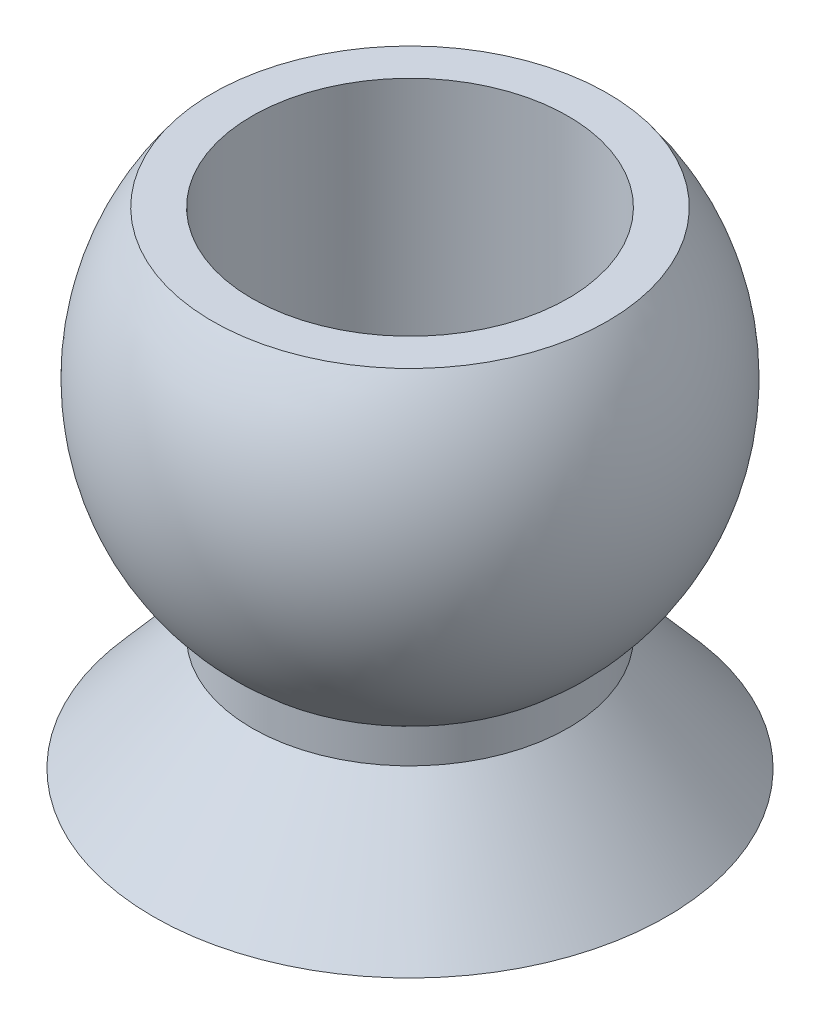
ISO-10303-21;
HEADER;
FILE_DESCRIPTION(('STEP AP214'),'2;1');
FILE_NAME('part.step','',(''),(''),'','','');
FILE_SCHEMA(('AUTOMOTIVE_DESIGN { 1 0 10303 214 1 1 1 1 }'));
ENDSEC;
DATA;
#1=APPLICATION_CONTEXT('core data for automotive mechanical design processes');
#2=APPLICATION_PROTOCOL_DEFINITION('international standard','automotive_design',2000,#1);
#3=PRODUCT_CONTEXT('',#1,'mechanical');
#4=PRODUCT('Part','Part','',(#3));
#5=PRODUCT_RELATED_PRODUCT_CATEGORY('part','',(#4));
#6=PRODUCT_DEFINITION_FORMATION('','',#4);
#7=PRODUCT_DEFINITION_CONTEXT('part definition',#1,'design');
#8=PRODUCT_DEFINITION('design','',#6,#7);
#9=PRODUCT_DEFINITION_SHAPE('','',#8);
#10=(LENGTH_UNIT() NAMED_UNIT(*) SI_UNIT(.MILLI.,.METRE.));
#11=(NAMED_UNIT(*) PLANE_ANGLE_UNIT() SI_UNIT($,.RADIAN.));
#12=(NAMED_UNIT(*) SI_UNIT($,.STERADIAN.) SOLID_ANGLE_UNIT());
#13=UNCERTAINTY_MEASURE_WITH_UNIT(LENGTH_MEASURE(1.E-05),#10,'distance_accuracy_value','');
#14=(GEOMETRIC_REPRESENTATION_CONTEXT(3) GLOBAL_UNCERTAINTY_ASSIGNED_CONTEXT((#13)) GLOBAL_UNIT_ASSIGNED_CONTEXT((#10,
#11,#12)) REPRESENTATION_CONTEXT('',''));
#15=CARTESIAN_POINT('',(0.,0.,0.));
#16=DIRECTION('',(0.,0.,1.));
#17=DIRECTION('',(1.,0.,0.));
#18=AXIS2_PLACEMENT_3D('',#15,#16,#17);
#19=CARTESIAN_POINT('',(0.,-0.960468635614927,0.));
#20=DIRECTION('',(0.,-1.,0.));
#21=DIRECTION('',(0.,0.,-1.));
#22=AXIS2_PLACEMENT_3D('',#19,#20,#21);
#23=PLANE('',#22);
#24=CARTESIAN_POINT('',(0.,-0.960468635614928,0.));
#25=DIRECTION('',(0.,1.,0.));
#26=DIRECTION('',(0.,0.,1.));
#27=AXIS2_PLACEMENT_3D('',#24,#25,#26);
#28=CIRCLE('',#27,0.8);
#29=CARTESIAN_POINT('',(0.,-0.960468635614928,0.8));
#30=VERTEX_POINT('',#29);
#31=EDGE_CURVE('E50',#30,#30,#28,.T.);
#32=ORIENTED_EDGE('',*,*,#31,.T.);
#33=EDGE_LOOP('',(#32));
#34=FACE_BOUND('',#33,.T.);
#35=ADVANCED_FACE('F40',(#34),#23,.F.);
#36=CARTESIAN_POINT('',(0.,-1.71046863561493,0.));
#37=DIRECTION('',(0.,1.,0.));
#38=DIRECTION('',(0.,0.,1.));
#39=AXIS2_PLACEMENT_3D('',#36,#37,#38);
#40=PLANE('',#39);
#41=CARTESIAN_POINT('',(0.,-1.71046863561493,0.));
#42=DIRECTION('',(0.,1.,0.));
#43=DIRECTION('',(0.,0.,1.));
#44=AXIS2_PLACEMENT_3D('',#41,#42,#43);
#45=CIRCLE('',#44,1.3);
#46=CARTESIAN_POINT('',(0.,-1.71046863561493,1.3));
#47=VERTEX_POINT('',#46);
#48=EDGE_CURVE('E11',#47,#47,#45,.T.);
#49=ORIENTED_EDGE('',*,*,#48,.F.);
#50=EDGE_LOOP('',(#49));
#51=FACE_BOUND('',#50,.T.);
#52=ADVANCED_FACE('F65',(#51),#40,.F.);
#53=CARTESIAN_POINT('',(0.,-1.71046863561493,0.));
#54=DIRECTION('',(0.,-1.,0.));
#55=DIRECTION('',(0.,0.,-1.));
#56=AXIS2_PLACEMENT_3D('',#53,#54,#55);
#57=CONICAL_SURFACE('',#56,1.3,0.714485779248294);
#58=CARTESIAN_POINT('',(0.,-1.1340058866526,0.));
#59=DIRECTION('',(0.,1.,0.));
#60=DIRECTION('',(0.,0.,1.));
#61=AXIS2_PLACEMENT_3D('',#58,#59,#60);
#62=CIRCLE('',#61,0.8);
#63=CARTESIAN_POINT('',(0.,-1.1340058866526,0.8));
#64=VERTEX_POINT('',#63);
#65=EDGE_CURVE('E46',#64,#64,#62,.T.);
#66=ORIENTED_EDGE('',*,*,#65,.F.);
#67=EDGE_LOOP('',(#66));
#68=FACE_BOUND('',#67,.T.);
#69=ORIENTED_EDGE('',*,*,#48,.T.);
#70=EDGE_LOOP('',(#69));
#71=FACE_BOUND('',#70,.T.);
#72=ADVANCED_FACE('F60',(#68,#71),#57,.T.);
#73=CARTESIAN_POINT('',(0.,-0.960468635614927,0.));
#74=DIRECTION('',(0.,1.,0.));
#75=DIRECTION('',(0.,0.,1.));
#76=AXIS2_PLACEMENT_3D('',#73,#74,#75);
#77=CYLINDRICAL_SURFACE('',#76,0.8);
#78=ORIENTED_EDGE('',*,*,#31,.F.);
#79=EDGE_LOOP('',(#78));
#80=FACE_BOUND('',#79,.T.);
#81=ORIENTED_EDGE('',*,*,#65,.T.);
#82=EDGE_LOOP('',(#81));
#83=FACE_BOUND('',#82,.T.);
#84=ADVANCED_FACE('F58',(#80,#83),#77,.T.);
#85=CLOSED_SHELL('',(#35,#52,#72,#84));
#86=MANIFOLD_SOLID_BREP('B2',#85);
#87=CARTESIAN_POINT('',(0.,0.,0.));
#88=DIRECTION('',(0.,1.,0.));
#89=DIRECTION('',(1.,0.,0.));
#90=AXIS2_PLACEMENT_3D('',#87,#88,#89);
#91=SPHERICAL_SURFACE('',#90,1.25);
#92=CARTESIAN_POINT('',(0.,-0.960468635614927,0.));
#93=DIRECTION('',(0.,1.,0.));
#94=DIRECTION('',(0.,0.,1.));
#95=AXIS2_PLACEMENT_3D('',#92,#93,#94);
#96=CIRCLE('',#95,0.8);
#97=CARTESIAN_POINT('',(0.8,-0.960468635614927,0.));
#98=VERTEX_POINT('',#97);
#99=EDGE_CURVE('E101',#98,#98,#96,.T.);
#100=CARTESIAN_POINT('',(0.,0.75,0.));
#101=DIRECTION('',(0.,1.,0.));
#102=DIRECTION('',(0.,0.,1.));
#103=AXIS2_PLACEMENT_3D('',#100,#101,#102);
#104=CIRCLE('',#103,1.);
#105=CARTESIAN_POINT('',(1.,0.75,0.));
#106=VERTEX_POINT('',#105);
#107=EDGE_CURVE('E39',#106,#106,#104,.T.);
#108=CARTESIAN_POINT('',(0.8,-0.960468635614927,0.));
#109=CARTESIAN_POINT('',(0.815205667588345,-0.947803923484943,0.));
#110=CARTESIAN_POINT('',(0.830110079251733,-0.934777576680409,0.));
#111=CARTESIAN_POINT('',(0.859283907284766,-0.90803222312377,0.));
#112=CARTESIAN_POINT('',(0.873553323654411,-0.894313216371665,0.));
#113=CARTESIAN_POINT('',(0.901424677656126,-0.866213152321417,0.));
#114=CARTESIAN_POINT('',(0.915026615288197,-0.851832095023274,0.));
#115=CARTESIAN_POINT('',(0.941532417408327,-0.822440450924054,0.));
#116=CARTESIAN_POINT('',(0.954436281896385,-0.807429864122978,0.));
#117=CARTESIAN_POINT('',(0.979516814820144,-0.776812989640467,0.));
#118=CARTESIAN_POINT('',(0.991693483255844,-0.761206701959032,0.));
#119=CARTESIAN_POINT('',(1.0152921687106,-0.729433627832434,0.));
#120=CARTESIAN_POINT('',(1.02671418572966,-0.713266841387271,0.));
#121=CARTESIAN_POINT('',(1.04877780751732,-0.680409227851081,0.));
#122=CARTESIAN_POINT('',(1.05941941228592,-0.663718400760055,0.));
#123=CARTESIAN_POINT('',(1.07989821072582,-0.629850348039727,0.));
#124=CARTESIAN_POINT('',(1.08973540439712,-0.612673122410426,0.));
#125=CARTESIAN_POINT('',(1.10858319539754,-0.577871011083512,0.));
#126=CARTESIAN_POINT('',(1.11759379272666,-0.5602461253859,0.));
#127=CARTESIAN_POINT('',(1.13476807010456,-0.524588442123593,0.));
#128=CARTESIAN_POINT('',(1.14293175015334,-0.506555644558898,0.));
#129=CARTESIAN_POINT('',(1.15839378198754,-0.470122805657166,0.));
#130=CARTESIAN_POINT('',(1.16569213377296,-0.45172276432013,0.));
#131=CARTESIAN_POINT('',(1.17940704962169,-0.4145969341987,0.));
#132=CARTESIAN_POINT('',(1.18582361368501,-0.395871145414308,0.));
#133=CARTESIAN_POINT('',(1.19776048326212,-0.35813605135554,0.));
#134=CARTESIAN_POINT('',(1.2032807887759,-0.339126746081166,0.));
#135=CARTESIAN_POINT('',(1.21341269169627,-0.300867489395462,0.));
#136=CARTESIAN_POINT('',(1.21802428910284,-0.281617537984132,0.));
#137=CARTESIAN_POINT('',(1.22632837559657,-0.242920402089686,0.));
#138=CARTESIAN_POINT('',(1.23002086468373,-0.223473217606568,0.));
#139=CARTESIAN_POINT('',(1.23647840712698,-0.184425473439681,0.));
#140=CARTESIAN_POINT('',(1.23924346048308,-0.164824913755912,0.));
#141=CARTESIAN_POINT('',(1.24383989563334,-0.125514622955176,0.));
#142=CARTESIAN_POINT('',(1.24567127742749,-0.105804891838209,0.));
#143=CARTESIAN_POINT('',(1.24839623926695,-0.0663207081452081,0.));
#144=CARTESIAN_POINT('',(1.24928981931225,-0.0465462555691745,0.));
#145=CARTESIAN_POINT('',(1.25013716242559,-0.00697722489394918,0.));
#146=CARTESIAN_POINT('',(1.25009092549363,0.0128173532052425,0.));
#147=CARTESIAN_POINT('',(1.2490587389274,0.0523819936032379,0.));
#148=CARTESIAN_POINT('',(1.24807278929314,0.0721520559020416,0.));
#149=CARTESIAN_POINT('',(1.24516340086517,0.111623078664317,0.));
#150=CARTESIAN_POINT('',(1.24323996207147,0.131324039127789,0.));
#151=CARTESIAN_POINT('',(1.23845993312193,0.170612428025588,0.));
#152=CARTESIAN_POINT('',(1.2356033429661,0.190199856459915,0.));
#153=CARTESIAN_POINT('',(1.22896345355708,0.229217007144163,0.));
#154=CARTESIAN_POINT('',(1.22518015430389,0.248646729394084,0.));
#155=CARTESIAN_POINT('',(1.21669537891945,0.287304649226425,0.));
#156=CARTESIAN_POINT('',(1.2119939027882,0.306532846808846,0.));
#157=CARTESIAN_POINT('',(1.20168337652023,0.344744353275929,0.));
#158=CARTESIAN_POINT('',(1.19607432638351,0.363727662160591,0.));
#159=CARTESIAN_POINT('',(1.18396130193913,0.401406579600174,0.));
#160=CARTESIAN_POINT('',(1.17745732763147,0.420102188155093,0.));
#161=CARTESIAN_POINT('',(1.16356912229035,0.457163541693315,0.));
#162=CARTESIAN_POINT('',(1.15618489125688,0.475529286676617,0.));
#163=CARTESIAN_POINT('',(1.14055282751296,0.511889495390992,0.));
#164=CARTESIAN_POINT('',(1.1323049948025,0.529883959122065,0.));
#165=CARTESIAN_POINT('',(1.11496432133316,0.56546101884385,0.));
#166=CARTESIAN_POINT('',(1.10587148057429,0.583043614834563,0.));
#167=CARTESIAN_POINT('',(1.08686132406368,0.617757304329181,0.));
#168=CARTESIAN_POINT('',(1.07694400831194,0.634888397833086,0.));
#169=CARTESIAN_POINT('',(1.05630716833398,0.668660380440582,0.));
#170=CARTESIAN_POINT('',(1.04558764410776,0.685301269544173,0.));
#171=CARTESIAN_POINT('',(1.02337093279529,0.718055565711681,0.));
#172=CARTESIAN_POINT('',(1.01187374570904,0.734168972775598,0.));
#173=CARTESIAN_POINT('',(1.,0.75,0.));
#174=B_SPLINE_CURVE_WITH_KNOTS('',3,(#108,#109,#110,#111,#112,#113,#114,#115,#116,#117,#118,
#119,#120,#121,#122,#123,#124,#125,#126,#127,#128,#129,#130,#131,#132,#133,#134,#135,#136,#137,
#138,#139,#140,#141,#142,#143,#144,#145,#146,#147,#148,#149,#150,#151,#152,#153,#154,#155,#156,
#157,#158,#159,#160,#161,#162,#163,#164,#165,#166,#167,#168,#169,#170,#171,#172,#173),
.UNSPECIFIED.,.F.,.F.,(4,2,2,2,2,2,2,2,2,2,2,2,2,2,2,2,2,2,2,2,2,2,2,2,2,2,2,2,2,2,2,2,4),(0.,
0.0593615755776777,0.118723151155355,0.178084726733033,0.237446302310711,0.296807877888388,
0.356169453466066,0.415531029043744,0.474892604621421,0.534254180199099,0.593615755776777,
0.652977331354454,0.712338906932132,0.77170048250981,0.831062058087487,0.890423633665165,
0.949785209242843,1.00914678482052,1.0685083603982,1.12786993597588,1.18723151155355,
1.24659308713123,1.30595466270891,1.36531623828659,1.42467781386426,1.48403938944194,
1.54340096501962,1.6027625405973,1.66212411617497,1.72148569175265,1.78084726733033,
1.84020884290801,1.89957041848568),.UNSPECIFIED.);
#175=EDGE_CURVE('BSEAM95',#98,#106,#174,.T.);
#176=ORIENTED_EDGE('',*,*,#99,.T.);
#177=ORIENTED_EDGE('',*,*,#107,.F.);
#178=ORIENTED_EDGE('',*,*,#175,.T.);
#179=ORIENTED_EDGE('',*,*,#175,.F.);
#180=EDGE_LOOP('',(#176,#178,#177,#179));
#181=FACE_BOUND('',#180,.T.);
#182=ADVANCED_FACE('F95',(#181),#91,.T.);
#183=CARTESIAN_POINT('',(0.,0.75,0.));
#184=DIRECTION('',(0.,1.,0.));
#185=DIRECTION('',(0.,0.,1.));
#186=AXIS2_PLACEMENT_3D('',#183,#184,#185);
#187=PLANE('',#186);
#188=CARTESIAN_POINT('',(0.,0.75,0.));
#189=DIRECTION('',(0.,1.,0.));
#190=DIRECTION('',(0.,0.,1.));
#191=AXIS2_PLACEMENT_3D('',#188,#189,#190);
#192=CIRCLE('',#191,0.8);
#193=CARTESIAN_POINT('',(0.,0.75,0.8));
#194=VERTEX_POINT('',#193);
#195=EDGE_CURVE('E105',#194,#194,#192,.T.);
#196=ORIENTED_EDGE('',*,*,#195,.F.);
#197=EDGE_LOOP('',(#196));
#198=FACE_BOUND('',#197,.T.);
#199=ORIENTED_EDGE('',*,*,#107,.T.);
#200=EDGE_LOOP('',(#199));
#201=FACE_BOUND('',#200,.T.);
#202=ADVANCED_FACE('F115',(#198,#201),#187,.T.);
#203=CARTESIAN_POINT('',(0.,-9.25,0.));
#204=DIRECTION('',(0.,1.,0.));
#205=DIRECTION('',(0.,0.,1.));
#206=AXIS2_PLACEMENT_3D('',#203,#204,#205);
#207=CYLINDRICAL_SURFACE('',#206,0.8);
#208=ORIENTED_EDGE('',*,*,#195,.T.);
#209=EDGE_LOOP('',(#208));
#210=FACE_BOUND('',#209,.T.);
#211=ORIENTED_EDGE('',*,*,#99,.F.);
#212=EDGE_LOOP('',(#211));
#213=FACE_BOUND('',#212,.T.);
#214=ADVANCED_FACE('F112',(#210,#213),#207,.F.);
#215=CLOSED_SHELL('',(#182,#202,#214));
#216=MANIFOLD_SOLID_BREP('B6',#215);
#217=ADVANCED_BREP_SHAPE_REPRESENTATION('',(#18,#86,#216),#14);
#218=SHAPE_DEFINITION_REPRESENTATION(#9,#217);
ENDSEC;
END-ISO-10303-21;
